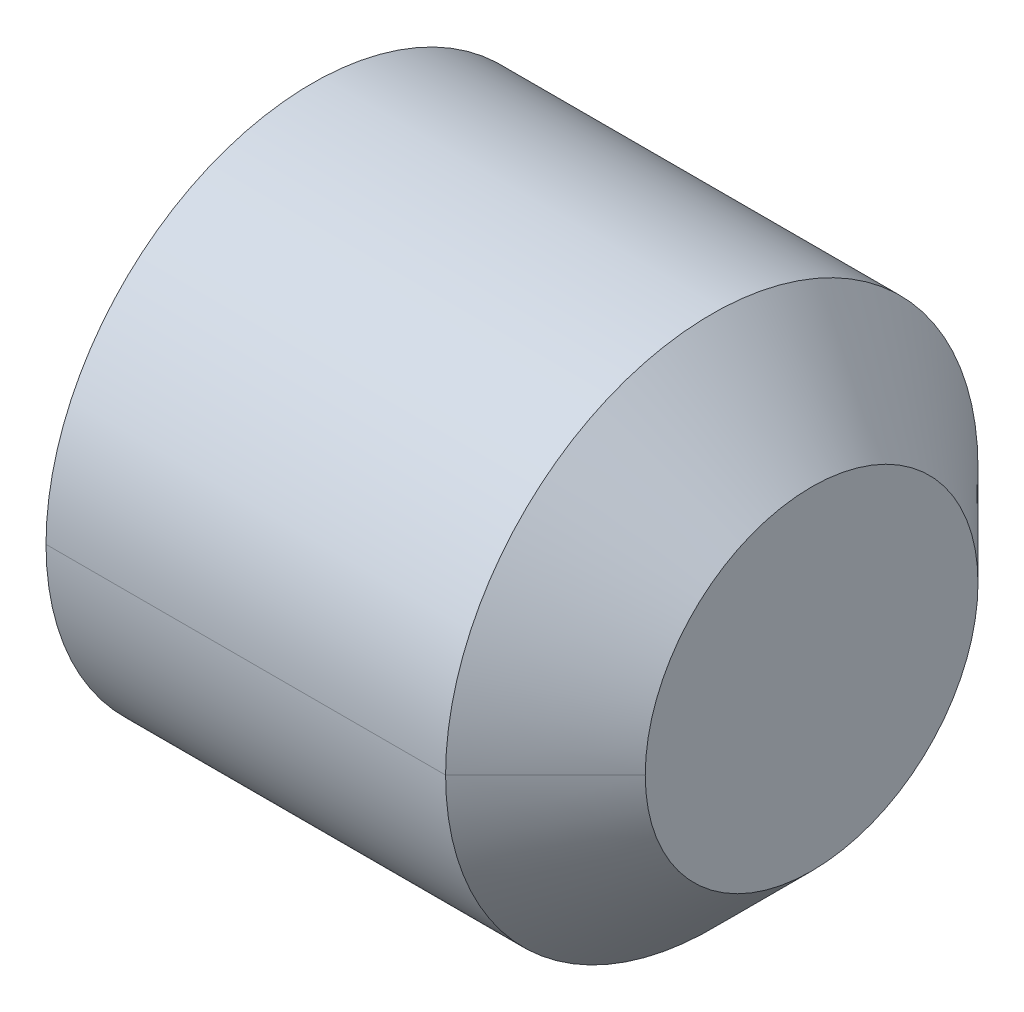
ISO-10303-21;
HEADER;
FILE_DESCRIPTION(('STEP AP214'),'2;1');
FILE_NAME('part.step','',(''),(''),'','','');
FILE_SCHEMA(('AUTOMOTIVE_DESIGN { 1 0 10303 214 1 1 1 1 }'));
ENDSEC;
DATA;
#1=APPLICATION_CONTEXT('core data for automotive mechanical design processes');
#2=APPLICATION_PROTOCOL_DEFINITION('international standard','automotive_design',2000,#1);
#3=PRODUCT_CONTEXT('',#1,'mechanical');
#4=PRODUCT('Part','Part','',(#3));
#5=PRODUCT_RELATED_PRODUCT_CATEGORY('part','',(#4));
#6=PRODUCT_DEFINITION_FORMATION('','',#4);
#7=PRODUCT_DEFINITION_CONTEXT('part definition',#1,'design');
#8=PRODUCT_DEFINITION('design','',#6,#7);
#9=PRODUCT_DEFINITION_SHAPE('','',#8);
#10=(LENGTH_UNIT() NAMED_UNIT(*) SI_UNIT(.MILLI.,.METRE.));
#11=(NAMED_UNIT(*) PLANE_ANGLE_UNIT() SI_UNIT($,.RADIAN.));
#12=(NAMED_UNIT(*) SI_UNIT($,.STERADIAN.) SOLID_ANGLE_UNIT());
#13=UNCERTAINTY_MEASURE_WITH_UNIT(LENGTH_MEASURE(1.E-05),#10,'distance_accuracy_value','');
#14=(GEOMETRIC_REPRESENTATION_CONTEXT(3) GLOBAL_UNCERTAINTY_ASSIGNED_CONTEXT((#13)) GLOBAL_UNIT_ASSIGNED_CONTEXT((#10,
#11,#12)) REPRESENTATION_CONTEXT('',''));
#15=CARTESIAN_POINT('',(0.,0.,0.));
#16=DIRECTION('',(0.,0.,1.));
#17=DIRECTION('',(1.,0.,0.));
#18=AXIS2_PLACEMENT_3D('',#15,#16,#17);
#19=CARTESIAN_POINT('',(0.,0.,0.));
#20=DIRECTION('',(-1.,0.,0.));
#21=DIRECTION('',(0.,0.5,-0.866025403784438));
#22=AXIS2_PLACEMENT_3D('',#19,#20,#21);
#23=CONICAL_SURFACE('',#22,1.1547005383793,1.04719755119661);
#24=CARTESIAN_POINT('',(-6.66766656401419E-05,-1.0002,0.577234799135792));
#25=CARTESIAN_POINT('',(0.0577152939960092,-0.826906068396553,0.677286097195978));
#26=CARTESIAN_POINT('',(0.093746113032798,-0.644906426589551,0.782363639385675));
#27=CARTESIAN_POINT('',(0.0845569672328784,-0.307587464600821,0.977114832892648));
#28=CARTESIAN_POINT('',(0.0502398555630194,-0.150674341172819,1.0677086669432));
#29=CARTESIAN_POINT('',(-6.66766656670301E-05,0.000199999999999927,1.15481600843314));
#30=B_SPLINE_CURVE_WITH_KNOTS('',3,(#24,#25,#26,#27,#28,#29),.UNSPECIFIED.,.F.,.F.,(4,2,4),(0.,
0.534580173806984,1.),.UNSPECIFIED.);
#31=CARTESIAN_POINT('',(0.,-1.,0.57735026918963));
#32=VERTEX_POINT('',#31);
#33=CARTESIAN_POINT('',(0.,0.,1.1547005383793));
#34=VERTEX_POINT('',#33);
#35=EDGE_CURVE('E11',#32,#34,#30,.T.);
#36=ORIENTED_EDGE('',*,*,#35,.F.);
#37=CARTESIAN_POINT('',(0.,0.,0.));
#38=DIRECTION('',(-1.,0.,0.));
#39=DIRECTION('',(0.,0.,1.));
#40=AXIS2_PLACEMENT_3D('',#37,#38,#39);
#41=CIRCLE('',#40,1.1547005383793);
#42=EDGE_CURVE('E26',#32,#34,#41,.T.);
#43=ORIENTED_EDGE('',*,*,#42,.T.);
#44=EDGE_LOOP('',(#36,#43));
#45=FACE_BOUND('',#44,.T.);
#46=ADVANCED_FACE('F17',(#45),#23,.F.);
#47=CARTESIAN_POINT('',(0.,-1.5705,0.));
#48=DIRECTION('',(1.,0.,0.));
#49=DIRECTION('',(0.,0.,-1.));
#50=AXIS2_PLACEMENT_3D('',#47,#48,#49);
#51=PLANE('',#50);
#52=CARTESIAN_POINT('',(0.,0.,0.));
#53=DIRECTION('',(-1.,0.,0.));
#54=DIRECTION('',(0.,0.,1.));
#55=AXIS2_PLACEMENT_3D('',#52,#53,#54);
#56=CIRCLE('',#55,1.1547005383793);
#57=CARTESIAN_POINT('',(0.,-1.,-0.57735026918963));
#58=VERTEX_POINT('',#57);
#59=EDGE_CURVE('E329',#58,#32,#56,.T.);
#60=ORIENTED_EDGE('',*,*,#59,.F.);
#61=CARTESIAN_POINT('',(0.,0.,0.));
#62=DIRECTION('',(-1.,0.,0.));
#63=DIRECTION('',(0.,0.,1.));
#64=AXIS2_PLACEMENT_3D('',#61,#62,#63);
#65=CIRCLE('',#64,1.1547005383793);
#66=CARTESIAN_POINT('',(0.,0.,-1.1547005383793));
#67=VERTEX_POINT('',#66);
#68=EDGE_CURVE('E325',#67,#58,#65,.T.);
#69=ORIENTED_EDGE('',*,*,#68,.F.);
#70=CARTESIAN_POINT('',(0.,0.,0.));
#71=DIRECTION('',(-1.,0.,0.));
#72=DIRECTION('',(0.,0.,1.));
#73=AXIS2_PLACEMENT_3D('',#70,#71,#72);
#74=CIRCLE('',#73,1.1547005383793);
#75=CARTESIAN_POINT('',(0.,1.,-0.57735026918963));
#76=VERTEX_POINT('',#75);
#77=EDGE_CURVE('E320',#76,#67,#74,.T.);
#78=ORIENTED_EDGE('',*,*,#77,.F.);
#79=CARTESIAN_POINT('',(0.,0.,0.));
#80=DIRECTION('',(-1.,0.,0.));
#81=DIRECTION('',(0.,0.,1.));
#82=AXIS2_PLACEMENT_3D('',#79,#80,#81);
#83=CIRCLE('',#82,1.1547005383793);
#84=CARTESIAN_POINT('',(0.,1.,0.577350269189723));
#85=VERTEX_POINT('',#84);
#86=EDGE_CURVE('E316',#85,#76,#83,.T.);
#87=ORIENTED_EDGE('',*,*,#86,.F.);
#88=CARTESIAN_POINT('',(0.,0.,0.));
#89=DIRECTION('',(-1.,0.,0.));
#90=DIRECTION('',(0.,0.,1.));
#91=AXIS2_PLACEMENT_3D('',#88,#89,#90);
#92=CIRCLE('',#91,1.1547005383793);
#93=EDGE_CURVE('E312',#34,#85,#92,.T.);
#94=ORIENTED_EDGE('',*,*,#93,.F.);
#95=ORIENTED_EDGE('',*,*,#42,.F.);
#96=EDGE_LOOP('',(#60,#69,#78,#87,#94,#95));
#97=FACE_BOUND('',#96,.T.);
#98=CARTESIAN_POINT('',(0.,0.,0.));
#99=DIRECTION('',(-1.,0.,0.));
#100=DIRECTION('',(0.,0.,1.));
#101=AXIS2_PLACEMENT_3D('',#98,#99,#100);
#102=CIRCLE('',#101,1.5705);
#103=CARTESIAN_POINT('',(0.,0.,1.5705));
#104=VERTEX_POINT('',#103);
#105=CARTESIAN_POINT('',(0.,0.,-1.5705));
#106=VERTEX_POINT('',#105);
#107=EDGE_CURVE('E308',#104,#106,#102,.T.);
#108=ORIENTED_EDGE('',*,*,#107,.T.);
#109=CARTESIAN_POINT('',(0.,0.,0.));
#110=DIRECTION('',(-1.,0.,0.));
#111=DIRECTION('',(0.,0.,1.));
#112=AXIS2_PLACEMENT_3D('',#109,#110,#111);
#113=CIRCLE('',#112,1.5705);
#114=EDGE_CURVE('E304',#106,#104,#113,.T.);
#115=ORIENTED_EDGE('',*,*,#114,.T.);
#116=EDGE_LOOP('',(#108,#115));
#117=FACE_BOUND('',#116,.T.);
#118=ADVANCED_FACE('F348',(#97,#117),#51,.F.);
#119=CARTESIAN_POINT('',(0.247971940616941,0.,0.));
#120=DIRECTION('',(1.,0.,0.));
#121=DIRECTION('',(0.,1.,0.));
#122=AXIS2_PLACEMENT_3D('',#119,#120,#121);
#123=CONICAL_SURFACE('',#122,2.,1.0471975511966);
#124=DIRECTION('',(0.499999999999994,0.,0.866025403784442));
#125=VECTOR('',#124,1.);
#126=CARTESIAN_POINT('',(0.,0.,1.5705));
#127=LINE('',#126,#125);
#128=CARTESIAN_POINT('',(0.247971940616941,0.,2.));
#129=VERTEX_POINT('',#128);
#130=EDGE_CURVE('E299',#104,#129,#127,.T.);
#131=ORIENTED_EDGE('',*,*,#130,.F.);
#132=ORIENTED_EDGE('',*,*,#114,.F.);
#133=DIRECTION('',(0.499999999999994,0.,-0.866025403784442));
#134=VECTOR('',#133,1.);
#135=CARTESIAN_POINT('',(0.,0.,-1.5705));
#136=LINE('',#135,#134);
#137=CARTESIAN_POINT('',(0.24797194061694,0.,-2.));
#138=VERTEX_POINT('',#137);
#139=EDGE_CURVE('E295',#106,#138,#136,.T.);
#140=ORIENTED_EDGE('',*,*,#139,.T.);
#141=CARTESIAN_POINT('',(0.247971940616941,0.,0.));
#142=DIRECTION('',(-1.,0.,0.));
#143=DIRECTION('',(0.,0.,1.));
#144=AXIS2_PLACEMENT_3D('',#141,#142,#143);
#145=CIRCLE('',#144,2.);
#146=EDGE_CURVE('E291',#138,#129,#145,.T.);
#147=ORIENTED_EDGE('',*,*,#146,.T.);
#148=EDGE_LOOP('',(#131,#132,#140,#147));
#149=FACE_BOUND('',#148,.T.);
#150=ADVANCED_FACE('F362',(#149),#123,.T.);
#151=CARTESIAN_POINT('',(0.66666666666667,0.,0.));
#152=DIRECTION('',(-1.,0.,0.));
#153=DIRECTION('',(0.,1.,0.));
#154=AXIS2_PLACEMENT_3D('',#151,#152,#153);
#155=CYLINDRICAL_SURFACE('',#154,2.);
#156=DIRECTION('',(-1.,0.,0.));
#157=VECTOR('',#156,1.);
#158=CARTESIAN_POINT('',(3.25,0.,-2.));
#159=LINE('',#158,#157);
#160=CARTESIAN_POINT('',(3.25,0.,-2.));
#161=VERTEX_POINT('',#160);
#162=EDGE_CURVE('E286',#161,#138,#159,.T.);
#163=ORIENTED_EDGE('',*,*,#162,.F.);
#164=CARTESIAN_POINT('',(3.25,0.,0.));
#165=DIRECTION('',(-1.,0.,0.));
#166=DIRECTION('',(0.,0.,1.));
#167=AXIS2_PLACEMENT_3D('',#164,#165,#166);
#168=CIRCLE('',#167,2.);
#169=CARTESIAN_POINT('',(3.25,0.,2.));
#170=VERTEX_POINT('',#169);
#171=EDGE_CURVE('E282',#161,#170,#168,.T.);
#172=ORIENTED_EDGE('',*,*,#171,.T.);
#173=DIRECTION('',(-1.,0.,0.));
#174=VECTOR('',#173,1.);
#175=CARTESIAN_POINT('',(3.25,0.,2.));
#176=LINE('',#175,#174);
#177=EDGE_CURVE('E277',#170,#129,#176,.T.);
#178=ORIENTED_EDGE('',*,*,#177,.T.);
#179=ORIENTED_EDGE('',*,*,#146,.F.);
#180=EDGE_LOOP('',(#163,#172,#178,#179));
#181=FACE_BOUND('',#180,.T.);
#182=ADVANCED_FACE('F366',(#181),#155,.T.);
#183=CARTESIAN_POINT('',(0.66666666666667,0.,0.));
#184=DIRECTION('',(-1.,0.,0.));
#185=DIRECTION('',(0.,-1.,0.));
#186=AXIS2_PLACEMENT_3D('',#183,#184,#185);
#187=CYLINDRICAL_SURFACE('',#186,2.);
#188=ORIENTED_EDGE('',*,*,#162,.T.);
#189=CARTESIAN_POINT('',(0.247971940616941,0.,0.));
#190=DIRECTION('',(-1.,0.,0.));
#191=DIRECTION('',(0.,0.,1.));
#192=AXIS2_PLACEMENT_3D('',#189,#190,#191);
#193=CIRCLE('',#192,2.);
#194=EDGE_CURVE('E272',#129,#138,#193,.T.);
#195=ORIENTED_EDGE('',*,*,#194,.F.);
#196=ORIENTED_EDGE('',*,*,#177,.F.);
#197=CARTESIAN_POINT('',(3.25,0.,0.));
#198=DIRECTION('',(-1.,0.,0.));
#199=DIRECTION('',(0.,0.,1.));
#200=AXIS2_PLACEMENT_3D('',#197,#198,#199);
#201=CIRCLE('',#200,2.);
#202=EDGE_CURVE('E267',#170,#161,#201,.T.);
#203=ORIENTED_EDGE('',*,*,#202,.T.);
#204=EDGE_LOOP('',(#188,#195,#196,#203));
#205=FACE_BOUND('',#204,.T.);
#206=ADVANCED_FACE('F372',(#205),#187,.T.);
#207=CARTESIAN_POINT('',(4.,0.,0.));
#208=DIRECTION('',(-1.,0.,0.));
#209=DIRECTION('',(0.,-1.,0.));
#210=AXIS2_PLACEMENT_3D('',#207,#208,#209);
#211=CONICAL_SURFACE('',#210,1.25,0.785398163397449);
#212=DIRECTION('',(-0.707106781186547,0.,-0.707106781186548));
#213=VECTOR('',#212,1.);
#214=CARTESIAN_POINT('',(4.,0.,-1.25));
#215=LINE('',#214,#213);
#216=CARTESIAN_POINT('',(4.,0.,-1.25));
#217=VERTEX_POINT('',#216);
#218=EDGE_CURVE('E262',#217,#161,#215,.T.);
#219=ORIENTED_EDGE('',*,*,#218,.T.);
#220=ORIENTED_EDGE('',*,*,#202,.F.);
#221=DIRECTION('',(-0.707106781186547,0.,0.707106781186548));
#222=VECTOR('',#221,1.);
#223=CARTESIAN_POINT('',(4.,0.,1.25));
#224=LINE('',#223,#222);
#225=CARTESIAN_POINT('',(4.,0.,1.25));
#226=VERTEX_POINT('',#225);
#227=EDGE_CURVE('E257',#226,#170,#224,.T.);
#228=ORIENTED_EDGE('',*,*,#227,.F.);
#229=CARTESIAN_POINT('',(4.,0.,0.));
#230=DIRECTION('',(-1.,0.,0.));
#231=DIRECTION('',(0.,0.,1.));
#232=AXIS2_PLACEMENT_3D('',#229,#230,#231);
#233=CIRCLE('',#232,1.25);
#234=EDGE_CURVE('E253',#226,#217,#233,.T.);
#235=ORIENTED_EDGE('',*,*,#234,.T.);
#236=EDGE_LOOP('',(#219,#220,#228,#235));
#237=FACE_BOUND('',#236,.T.);
#238=ADVANCED_FACE('F376',(#237),#211,.T.);
#239=CARTESIAN_POINT('',(4.,0.,0.));
#240=DIRECTION('',(-1.,0.,0.));
#241=DIRECTION('',(0.,0.,1.));
#242=AXIS2_PLACEMENT_3D('',#239,#240,#241);
#243=PLANE('',#242);
#244=CARTESIAN_POINT('',(4.,0.,0.));
#245=DIRECTION('',(-1.,0.,0.));
#246=DIRECTION('',(0.,0.,1.));
#247=AXIS2_PLACEMENT_3D('',#244,#245,#246);
#248=CIRCLE('',#247,1.25);
#249=EDGE_CURVE('E250',#217,#226,#248,.T.);
#250=ORIENTED_EDGE('',*,*,#249,.F.);
#251=ORIENTED_EDGE('',*,*,#234,.F.);
#252=EDGE_LOOP('',(#250,#251));
#253=FACE_BOUND('',#252,.T.);
#254=ADVANCED_FACE('F380',(#253),#243,.F.);
#255=CARTESIAN_POINT('',(4.,0.,0.));
#256=DIRECTION('',(-1.,0.,0.));
#257=DIRECTION('',(0.,1.,0.));
#258=AXIS2_PLACEMENT_3D('',#255,#256,#257);
#259=CONICAL_SURFACE('',#258,1.25,0.785398163397449);
#260=ORIENTED_EDGE('',*,*,#218,.F.);
#261=ORIENTED_EDGE('',*,*,#249,.T.);
#262=ORIENTED_EDGE('',*,*,#227,.T.);
#263=ORIENTED_EDGE('',*,*,#171,.F.);
#264=EDGE_LOOP('',(#260,#261,#262,#263));
#265=FACE_BOUND('',#264,.T.);
#266=ADVANCED_FACE('F356',(#265),#259,.T.);
#267=CARTESIAN_POINT('',(0.247971940616941,0.,0.));
#268=DIRECTION('',(1.,0.,0.));
#269=DIRECTION('',(0.,-1.,0.));
#270=AXIS2_PLACEMENT_3D('',#267,#268,#269);
#271=CONICAL_SURFACE('',#270,2.,1.0471975511966);
#272=ORIENTED_EDGE('',*,*,#130,.T.);
#273=ORIENTED_EDGE('',*,*,#194,.T.);
#274=ORIENTED_EDGE('',*,*,#139,.F.);
#275=ORIENTED_EDGE('',*,*,#107,.F.);
#276=EDGE_LOOP('',(#272,#273,#274,#275));
#277=FACE_BOUND('',#276,.T.);
#278=ADVANCED_FACE('F351',(#277),#271,.T.);
#279=CARTESIAN_POINT('',(0.,0.,0.));
#280=DIRECTION('',(-1.,0.,0.));
#281=DIRECTION('',(0.,-0.5,-0.866025403784439));
#282=AXIS2_PLACEMENT_3D('',#279,#280,#281);
#283=CONICAL_SURFACE('',#282,1.1547005383793,1.04719755119661);
#284=CARTESIAN_POINT('',(-6.66766656668132E-05,-0.000200000000000113,1.15481600843314));
#285=CARTESIAN_POINT('',(0.0577152939959912,0.173093931603452,1.05476471037295));
#286=CARTESIAN_POINT('',(0.093746113032791,0.35509357341046,0.949687168183249));
#287=CARTESIAN_POINT('',(0.0845569672328881,0.69241253539919,0.754935974676276));
#288=CARTESIAN_POINT('',(0.0502398555630387,0.849325658827186,0.66434214062573));
#289=CARTESIAN_POINT('',(-6.66766656390577E-05,1.0002,0.577234799135792));
#290=B_SPLINE_CURVE_WITH_KNOTS('',3,(#284,#285,#286,#287,#288,#289),.UNSPECIFIED.,.F.,.F.,(4,2,
4),(0.,0.534580173807005,1.),.UNSPECIFIED.);
#291=EDGE_CURVE('E238',#34,#85,#290,.T.);
#292=ORIENTED_EDGE('',*,*,#291,.F.);
#293=ORIENTED_EDGE('',*,*,#93,.T.);
#294=EDGE_LOOP('',(#292,#293));
#295=FACE_BOUND('',#294,.T.);
#296=ADVANCED_FACE('F218',(#295),#283,.F.);
#297=CARTESIAN_POINT('',(1.5,1.,0.57735026918963));
#298=DIRECTION('',(0.,-0.500000000000029,-0.866025403784422));
#299=DIRECTION('',(0.,0.866025403784422,-0.500000000000029));
#300=AXIS2_PLACEMENT_3D('',#297,#298,#299);
#301=PLANE('',#300);
#302=ORIENTED_EDGE('',*,*,#291,.T.);
#303=DIRECTION('',(-1.,0.,0.));
#304=VECTOR('',#303,1.);
#305=CARTESIAN_POINT('',(1.5,1.,0.57735026918963));
#306=LINE('',#305,#304);
#307=CARTESIAN_POINT('',(1.5,1.,0.57735026918963));
#308=VERTEX_POINT('',#307);
#309=EDGE_CURVE('E636',#308,#85,#306,.T.);
#310=ORIENTED_EDGE('',*,*,#309,.F.);
#311=DIRECTION('',(0.,-0.866025403784422,0.500000000000029));
#312=VECTOR('',#311,1.);
#313=CARTESIAN_POINT('',(1.5,1.,0.57735026918963));
#314=LINE('',#313,#312);
#315=CARTESIAN_POINT('',(1.5,0.,1.1547005383793));
#316=VERTEX_POINT('',#315);
#317=EDGE_CURVE('E109',#308,#316,#314,.T.);
#318=ORIENTED_EDGE('',*,*,#317,.T.);
#319=DIRECTION('',(-1.,0.,0.));
#320=VECTOR('',#319,1.);
#321=CARTESIAN_POINT('',(1.5,0.,1.1547005383793));
#322=LINE('',#321,#320);
#323=EDGE_CURVE('E197',#316,#34,#322,.T.);
#324=ORIENTED_EDGE('',*,*,#323,.T.);
#325=EDGE_LOOP('',(#302,#310,#318,#324));
#326=FACE_BOUND('',#325,.T.);
#327=ADVANCED_FACE('F213',(#326),#301,.T.);
#328=CARTESIAN_POINT('',(1.5,0.,1.1547005383793));
#329=DIRECTION('',(0.,0.500000000000029,-0.866025403784422));
#330=DIRECTION('',(0.,0.866025403784422,0.500000000000029));
#331=AXIS2_PLACEMENT_3D('',#328,#329,#330);
#332=PLANE('',#331);
#333=ORIENTED_EDGE('',*,*,#35,.T.);
#334=ORIENTED_EDGE('',*,*,#323,.F.);
#335=DIRECTION('',(0.,-0.866025403784422,-0.500000000000029));
#336=VECTOR('',#335,1.);
#337=CARTESIAN_POINT('',(1.5,0.,1.1547005383793));
#338=LINE('',#337,#336);
#339=CARTESIAN_POINT('',(1.5,-1.,0.57735026918963));
#340=VERTEX_POINT('',#339);
#341=EDGE_CURVE('E193',#316,#340,#338,.T.);
#342=ORIENTED_EDGE('',*,*,#341,.T.);
#343=DIRECTION('',(-1.,0.,0.));
#344=VECTOR('',#343,1.);
#345=CARTESIAN_POINT('',(1.5,-1.,0.57735026918963));
#346=LINE('',#345,#344);
#347=EDGE_CURVE('E191',#340,#32,#346,.T.);
#348=ORIENTED_EDGE('',*,*,#347,.T.);
#349=EDGE_LOOP('',(#333,#334,#342,#348));
#350=FACE_BOUND('',#349,.T.);
#351=ADVANCED_FACE('F204',(#350),#332,.T.);
#352=CARTESIAN_POINT('',(1.5,-1.,0.57735026918963));
#353=DIRECTION('',(0.,1.,0.));
#354=DIRECTION('',(0.,0.,1.));
#355=AXIS2_PLACEMENT_3D('',#352,#353,#354);
#356=PLANE('',#355);
#357=CARTESIAN_POINT('',(0.,-1.,-0.57735026918963));
#358=CARTESIAN_POINT('',(0.0163464629712412,-1.,-0.520724460409162));
#359=CARTESIAN_POINT('',(0.0313228666109428,-1.,-0.462424053164438));
#360=CARTESIAN_POINT('',(0.0850768192364993,-1.,-0.214304555371986));
#361=CARTESIAN_POINT('',(0.0998682543641666,-1.,-0.0150788490781858));
#362=CARTESIAN_POINT('',(0.0664924632660265,-1.,0.313257289602856));
#363=CARTESIAN_POINT('',(0.0374673993330237,-1.,0.447559390645087));
#364=CARTESIAN_POINT('',(0.,-1.,0.57735026918963));
#365=B_SPLINE_CURVE_WITH_KNOTS('',3,(#357,#358,#359,#360,#361,#362,#363,#364),.UNSPECIFIED.,.F.,
.F.,(4,2,2,4),(0.,0.151524785900437,0.652693082768378,1.),.UNSPECIFIED.);
#366=EDGE_CURVE('E174',#58,#32,#365,.T.);
#367=ORIENTED_EDGE('',*,*,#366,.T.);
#368=ORIENTED_EDGE('',*,*,#347,.F.);
#369=DIRECTION('',(0.,0.,-1.));
#370=VECTOR('',#369,1.);
#371=CARTESIAN_POINT('',(1.5,-1.,0.57735026918963));
#372=LINE('',#371,#370);
#373=CARTESIAN_POINT('',(1.5,-1.,-0.57735026918963));
#374=VERTEX_POINT('',#373);
#375=EDGE_CURVE('E170',#340,#374,#372,.T.);
#376=ORIENTED_EDGE('',*,*,#375,.T.);
#377=DIRECTION('',(-1.,0.,0.));
#378=VECTOR('',#377,1.);
#379=CARTESIAN_POINT('',(1.5,-1.,-0.57735026918963));
#380=LINE('',#379,#378);
#381=EDGE_CURVE('E167',#374,#58,#380,.T.);
#382=ORIENTED_EDGE('',*,*,#381,.T.);
#383=EDGE_LOOP('',(#367,#368,#376,#382));
#384=FACE_BOUND('',#383,.T.);
#385=ADVANCED_FACE('F145',(#384),#356,.T.);
#386=CARTESIAN_POINT('',(1.5,-1.,-0.57735026918963));
#387=DIRECTION('',(0.,0.500000000000029,0.866025403784422));
#388=DIRECTION('',(0.,-0.866025403784422,0.500000000000029));
#389=AXIS2_PLACEMENT_3D('',#386,#387,#388);
#390=PLANE('',#389);
#391=CARTESIAN_POINT('',(-6.66766656668132E-05,0.000200000000000113,-1.15481600843314));
#392=CARTESIAN_POINT('',(0.0577152939959912,-0.173093931603452,-1.05476471037295));
#393=CARTESIAN_POINT('',(0.093746113032791,-0.35509357341046,-0.949687168183249));
#394=CARTESIAN_POINT('',(0.0845569672328881,-0.69241253539919,-0.754935974676276));
#395=CARTESIAN_POINT('',(0.0502398555630387,-0.849325658827186,-0.66434214062573));
#396=CARTESIAN_POINT('',(-6.66766656390577E-05,-1.0002,-0.577234799135792));
#397=B_SPLINE_CURVE_WITH_KNOTS('',3,(#391,#392,#393,#394,#395,#396),.UNSPECIFIED.,.F.,.F.,(4,2,
4),(0.,0.534580173807005,1.),.UNSPECIFIED.);
#398=EDGE_CURVE('E165',#67,#58,#397,.T.);
#399=ORIENTED_EDGE('',*,*,#398,.T.);
#400=ORIENTED_EDGE('',*,*,#381,.F.);
#401=DIRECTION('',(0.,0.866025403784422,-0.500000000000029));
#402=VECTOR('',#401,1.);
#403=CARTESIAN_POINT('',(1.5,-1.,-0.57735026918963));
#404=LINE('',#403,#402);
#405=CARTESIAN_POINT('',(1.5,0.,-1.1547005383793));
#406=VERTEX_POINT('',#405);
#407=EDGE_CURVE('E644',#374,#406,#404,.T.);
#408=ORIENTED_EDGE('',*,*,#407,.T.);
#409=DIRECTION('',(-1.,0.,0.));
#410=VECTOR('',#409,1.);
#411=CARTESIAN_POINT('',(1.5,0.,-1.1547005383793));
#412=LINE('',#411,#410);
#413=EDGE_CURVE('E99',#406,#67,#412,.T.);
#414=ORIENTED_EDGE('',*,*,#413,.T.);
#415=EDGE_LOOP('',(#399,#400,#408,#414));
#416=FACE_BOUND('',#415,.T.);
#417=ADVANCED_FACE('F139',(#416),#390,.T.);
#418=CARTESIAN_POINT('',(1.5,0.,-1.1547005383793));
#419=DIRECTION('',(0.,-0.500000000000029,0.866025403784422));
#420=DIRECTION('',(0.,-0.866025403784422,-0.500000000000029));
#421=AXIS2_PLACEMENT_3D('',#418,#419,#420);
#422=PLANE('',#421);
#423=CARTESIAN_POINT('',(-6.66766656401419E-05,1.0002,-0.577234799135792));
#424=CARTESIAN_POINT('',(0.0577152939960092,0.826906068396553,-0.677286097195978));
#425=CARTESIAN_POINT('',(0.093746113032798,0.64490642658955,-0.782363639385675));
#426=CARTESIAN_POINT('',(0.0845569672328784,0.307587464600821,-0.977114832892648));
#427=CARTESIAN_POINT('',(0.0502398555630194,0.150674341172819,-1.0677086669432));
#428=CARTESIAN_POINT('',(-6.66766656670301E-05,-0.000199999999999927,-1.15481600843314));
#429=B_SPLINE_CURVE_WITH_KNOTS('',3,(#423,#424,#425,#426,#427,#428),.UNSPECIFIED.,.F.,.F.,(4,2,
4),(0.,0.534580173806984,1.),.UNSPECIFIED.);
#430=EDGE_CURVE('E102',#76,#67,#429,.T.);
#431=ORIENTED_EDGE('',*,*,#430,.T.);
#432=ORIENTED_EDGE('',*,*,#413,.F.);
#433=DIRECTION('',(0.,0.866025403784422,0.500000000000029));
#434=VECTOR('',#433,1.);
#435=CARTESIAN_POINT('',(1.5,0.,-1.1547005383793));
#436=LINE('',#435,#434);
#437=CARTESIAN_POINT('',(1.5,1.,-0.57735026918963));
#438=VERTEX_POINT('',#437);
#439=EDGE_CURVE('E91',#406,#438,#436,.T.);
#440=ORIENTED_EDGE('',*,*,#439,.T.);
#441=DIRECTION('',(-1.,0.,0.));
#442=VECTOR('',#441,1.);
#443=CARTESIAN_POINT('',(1.5,1.,-0.57735026918963));
#444=LINE('',#443,#442);
#445=EDGE_CURVE('E96',#438,#76,#444,.T.);
#446=ORIENTED_EDGE('',*,*,#445,.T.);
#447=EDGE_LOOP('',(#431,#432,#440,#446));
#448=FACE_BOUND('',#447,.T.);
#449=ADVANCED_FACE('F94',(#448),#422,.T.);
#450=CARTESIAN_POINT('',(1.5,1.,-0.57735026918963));
#451=DIRECTION('',(0.,-1.,0.));
#452=DIRECTION('',(0.,0.,-1.));
#453=AXIS2_PLACEMENT_3D('',#450,#451,#452);
#454=PLANE('',#453);
#455=CARTESIAN_POINT('',(0.,1.,0.577350269189723));
#456=CARTESIAN_POINT('',(0.0374673993330365,1.,0.447559390645152));
#457=CARTESIAN_POINT('',(0.0664924632660234,1.,0.313257289602886));
#458=CARTESIAN_POINT('',(0.0998682543641666,1.,-0.0150788490781854));
#459=CARTESIAN_POINT('',(0.0850768192364993,1.,-0.214304555371985));
#460=CARTESIAN_POINT('',(0.0313228666109428,1.,-0.462424053164438));
#461=CARTESIAN_POINT('',(0.0163464629712412,1.,-0.520724460409162));
#462=CARTESIAN_POINT('',(0.,1.,-0.57735026918963));
#463=B_SPLINE_CURVE_WITH_KNOTS('',3,(#455,#456,#457,#458,#459,#460,#461,#462),.UNSPECIFIED.,.F.,
.F.,(4,2,2,4),(0.,0.347306917231672,0.848475214099574,1.),.UNSPECIFIED.);
#464=EDGE_CURVE('E112',#85,#76,#463,.T.);
#465=ORIENTED_EDGE('',*,*,#464,.T.);
#466=ORIENTED_EDGE('',*,*,#445,.F.);
#467=DIRECTION('',(0.,0.,1.));
#468=VECTOR('',#467,1.);
#469=CARTESIAN_POINT('',(1.5,1.,-0.57735026918963));
#470=LINE('',#469,#468);
#471=EDGE_CURVE('E106',#438,#308,#470,.T.);
#472=ORIENTED_EDGE('',*,*,#471,.T.);
#473=ORIENTED_EDGE('',*,*,#309,.T.);
#474=EDGE_LOOP('',(#465,#466,#472,#473));
#475=FACE_BOUND('',#474,.T.);
#476=ADVANCED_FACE('F114',(#475),#454,.T.);
#477=CARTESIAN_POINT('',(1.5,0.,0.));
#478=DIRECTION('',(1.,0.,0.));
#479=DIRECTION('',(0.,0.,-1.));
#480=AXIS2_PLACEMENT_3D('',#477,#478,#479);
#481=PLANE('',#480);
#482=ORIENTED_EDGE('',*,*,#317,.F.);
#483=ORIENTED_EDGE('',*,*,#471,.F.);
#484=ORIENTED_EDGE('',*,*,#439,.F.);
#485=ORIENTED_EDGE('',*,*,#407,.F.);
#486=ORIENTED_EDGE('',*,*,#375,.F.);
#487=ORIENTED_EDGE('',*,*,#341,.F.);
#488=EDGE_LOOP('',(#482,#483,#484,#485,#486,#487));
#489=FACE_BOUND('',#488,.T.);
#490=ADVANCED_FACE('F107',(#489),#481,.F.);
#491=CARTESIAN_POINT('',(0.,0.,0.));
#492=DIRECTION('',(-1.,0.,0.));
#493=DIRECTION('',(0.,-1.,0.));
#494=AXIS2_PLACEMENT_3D('',#491,#492,#493);
#495=CONICAL_SURFACE('',#494,1.1547005383793,1.04719755119661);
#496=ORIENTED_EDGE('',*,*,#464,.F.);
#497=ORIENTED_EDGE('',*,*,#86,.T.);
#498=EDGE_LOOP('',(#496,#497));
#499=FACE_BOUND('',#498,.T.);
#500=ADVANCED_FACE('F471',(#499),#495,.F.);
#501=CARTESIAN_POINT('',(0.,0.,0.));
#502=DIRECTION('',(-1.,0.,0.));
#503=DIRECTION('',(0.,-0.499999999999998,0.86602540378444));
#504=AXIS2_PLACEMENT_3D('',#501,#502,#503);
#505=CONICAL_SURFACE('',#504,1.1547005383793,1.04719755119661);
#506=ORIENTED_EDGE('',*,*,#430,.F.);
#507=ORIENTED_EDGE('',*,*,#77,.T.);
#508=EDGE_LOOP('',(#506,#507));
#509=FACE_BOUND('',#508,.T.);
#510=ADVANCED_FACE('F480',(#509),#505,.F.);
#511=CARTESIAN_POINT('',(0.,0.,0.));
#512=DIRECTION('',(-1.,0.,0.));
#513=DIRECTION('',(0.,0.5,0.866025403784439));
#514=AXIS2_PLACEMENT_3D('',#511,#512,#513);
#515=CONICAL_SURFACE('',#514,1.1547005383793,1.04719755119661);
#516=ORIENTED_EDGE('',*,*,#398,.F.);
#517=ORIENTED_EDGE('',*,*,#68,.T.);
#518=EDGE_LOOP('',(#516,#517));
#519=FACE_BOUND('',#518,.T.);
#520=ADVANCED_FACE('F491',(#519),#515,.F.);
#521=CARTESIAN_POINT('',(0.,0.,0.));
#522=DIRECTION('',(-1.,0.,0.));
#523=DIRECTION('',(0.,1.,0.));
#524=AXIS2_PLACEMENT_3D('',#521,#522,#523);
#525=CONICAL_SURFACE('',#524,1.1547005383793,1.04719755119661);
#526=ORIENTED_EDGE('',*,*,#366,.F.);
#527=ORIENTED_EDGE('',*,*,#59,.T.);
#528=EDGE_LOOP('',(#526,#527));
#529=FACE_BOUND('',#528,.T.);
#530=ADVANCED_FACE('F345',(#529),#525,.F.);
#531=CLOSED_SHELL('',(#46,#118,#150,#182,#206,#238,#254,#266,#278,#296,#327,#351,#385,#417,#449,
#476,#490,#500,#510,#520,#530));
#532=MANIFOLD_SOLID_BREP('B1',#531);
#533=ADVANCED_BREP_SHAPE_REPRESENTATION('',(#18,#532),#14);
#534=SHAPE_DEFINITION_REPRESENTATION(#9,#533);
ENDSEC;
END-ISO-10303-21;
